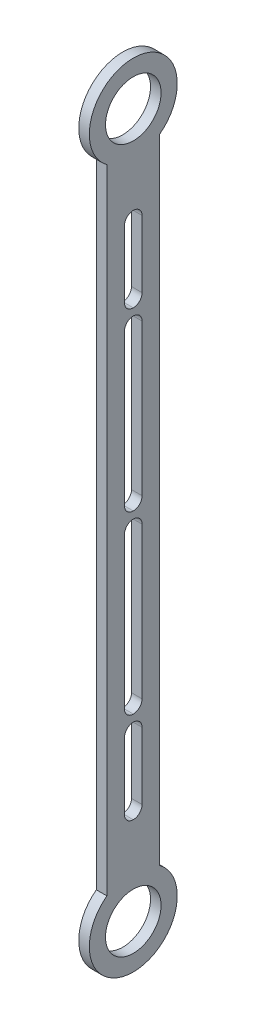
ISO-10303-21;
HEADER;
FILE_DESCRIPTION(('STEP AP214'),'2;1');
FILE_NAME('part.step','',(''),(''),'','','');
FILE_SCHEMA(('AUTOMOTIVE_DESIGN { 1 0 10303 214 1 1 1 1 }'));
ENDSEC;
DATA;
#1=APPLICATION_CONTEXT('core data for automotive mechanical design processes');
#2=APPLICATION_PROTOCOL_DEFINITION('international standard','automotive_design',2000,#1);
#3=PRODUCT_CONTEXT('',#1,'mechanical');
#4=PRODUCT('Part','Part','',(#3));
#5=PRODUCT_RELATED_PRODUCT_CATEGORY('part','',(#4));
#6=PRODUCT_DEFINITION_FORMATION('','',#4);
#7=PRODUCT_DEFINITION_CONTEXT('part definition',#1,'design');
#8=PRODUCT_DEFINITION('design','',#6,#7);
#9=PRODUCT_DEFINITION_SHAPE('','',#8);
#10=(LENGTH_UNIT() NAMED_UNIT(*) SI_UNIT(.MILLI.,.METRE.));
#11=(NAMED_UNIT(*) PLANE_ANGLE_UNIT() SI_UNIT($,.RADIAN.));
#12=(NAMED_UNIT(*) SI_UNIT($,.STERADIAN.) SOLID_ANGLE_UNIT());
#13=UNCERTAINTY_MEASURE_WITH_UNIT(LENGTH_MEASURE(1.E-05),#10,'distance_accuracy_value','');
#14=(GEOMETRIC_REPRESENTATION_CONTEXT(3) GLOBAL_UNCERTAINTY_ASSIGNED_CONTEXT((#13)) GLOBAL_UNIT_ASSIGNED_CONTEXT((#10,
#11,#12)) REPRESENTATION_CONTEXT('',''));
#15=CARTESIAN_POINT('',(0.,0.,0.));
#16=DIRECTION('',(0.,0.,1.));
#17=DIRECTION('',(1.,0.,0.));
#18=AXIS2_PLACEMENT_3D('',#15,#16,#17);
#19=CARTESIAN_POINT('',(0.,175.,2.50000000000002));
#20=DIRECTION('',(0.,0.,1.));
#21=DIRECTION('',(0.,-1.,0.));
#22=AXIS2_PLACEMENT_3D('',#19,#20,#21);
#23=PLANE('',#22);
#24=DIRECTION('',(0.,-1.,0.));
#25=VECTOR('',#24,1.);
#26=CARTESIAN_POINT('',(3.,175.,2.50000000000002));
#27=LINE('',#26,#25);
#28=CARTESIAN_POINT('',(3.,96.5070441090992,2.50000000000001));
#29=VERTEX_POINT('',#28);
#30=CARTESIAN_POINT('',(3.,53.5070441090992,2.5));
#31=VERTEX_POINT('',#30);
#32=EDGE_CURVE('E496',#29,#31,#27,.T.);
#33=ORIENTED_EDGE('',*,*,#32,.T.);
#34=DIRECTION('',(1.,0.,0.));
#35=VECTOR('',#34,1.);
#36=CARTESIAN_POINT('',(0.,53.5070441090992,2.5));
#37=LINE('',#36,#35);
#38=CARTESIAN_POINT('',(0.,53.5070441090992,2.5));
#39=VERTEX_POINT('',#38);
#40=EDGE_CURVE('E332',#31,#39,#37,.F.);
#41=ORIENTED_EDGE('',*,*,#40,.T.);
#42=DIRECTION('',(0.,-1.,0.));
#43=VECTOR('',#42,1.);
#44=CARTESIAN_POINT('',(0.,175.,2.50000000000002));
#45=LINE('',#44,#43);
#46=CARTESIAN_POINT('',(0.,96.5070441090992,2.50000000000001));
#47=VERTEX_POINT('',#46);
#48=EDGE_CURVE('E456',#47,#39,#45,.T.);
#49=ORIENTED_EDGE('',*,*,#48,.F.);
#50=DIRECTION('',(1.,0.,0.));
#51=VECTOR('',#50,1.);
#52=CARTESIAN_POINT('',(0.,96.5070441090992,2.50000000000001));
#53=LINE('',#52,#51);
#54=EDGE_CURVE('E330',#47,#29,#53,.T.);
#55=ORIENTED_EDGE('',*,*,#54,.T.);
#56=EDGE_LOOP('',(#33,#41,#49,#55));
#57=FACE_BOUND('',#56,.T.);
#58=ADVANCED_FACE('F38',(#57),#23,.F.);
#59=CARTESIAN_POINT('',(0.,175.,-2.50000000000002));
#60=DIRECTION('',(0.,0.,-1.));
#61=DIRECTION('',(0.,1.,0.));
#62=AXIS2_PLACEMENT_3D('',#59,#60,#61);
#63=PLANE('',#62);
#64=DIRECTION('',(0.,1.,0.));
#65=VECTOR('',#64,1.);
#66=CARTESIAN_POINT('',(0.,175.,-2.50000000000002));
#67=LINE('',#66,#65);
#68=CARTESIAN_POINT('',(0.,53.5070441090992,-2.5));
#69=VERTEX_POINT('',#68);
#70=CARTESIAN_POINT('',(0.,96.5070441090992,-2.50000000000001));
#71=VERTEX_POINT('',#70);
#72=EDGE_CURVE('E427',#69,#71,#67,.T.);
#73=ORIENTED_EDGE('',*,*,#72,.F.);
#74=DIRECTION('',(1.,0.,0.));
#75=VECTOR('',#74,1.);
#76=CARTESIAN_POINT('',(0.,53.5070441090992,-2.5));
#77=LINE('',#76,#75);
#78=CARTESIAN_POINT('',(3.,53.5070441090992,-2.5));
#79=VERTEX_POINT('',#78);
#80=EDGE_CURVE('E338',#69,#79,#77,.T.);
#81=ORIENTED_EDGE('',*,*,#80,.T.);
#82=DIRECTION('',(0.,1.,0.));
#83=VECTOR('',#82,1.);
#84=CARTESIAN_POINT('',(3.,175.,-2.50000000000002));
#85=LINE('',#84,#83);
#86=CARTESIAN_POINT('',(3.,96.5070441090992,-2.50000000000001));
#87=VERTEX_POINT('',#86);
#88=EDGE_CURVE('E459',#79,#87,#85,.T.);
#89=ORIENTED_EDGE('',*,*,#88,.T.);
#90=DIRECTION('',(1.,0.,0.));
#91=VECTOR('',#90,1.);
#92=CARTESIAN_POINT('',(0.,96.5070441090992,-2.50000000000001));
#93=LINE('',#92,#91);
#94=EDGE_CURVE('E335',#87,#71,#93,.F.);
#95=ORIENTED_EDGE('',*,*,#94,.T.);
#96=EDGE_LOOP('',(#73,#81,#89,#95));
#97=FACE_BOUND('',#96,.T.);
#98=ADVANCED_FACE('F514',(#97),#63,.F.);
#99=CARTESIAN_POINT('',(3.,172.5,2.50000000000002));
#100=VERTEX_POINT('',#99);
#101=CARTESIAN_POINT('',(3.,153.507044109099,2.50000000000002));
#102=VERTEX_POINT('',#101);
#103=EDGE_CURVE('E464',#100,#102,#27,.T.);
#104=ORIENTED_EDGE('',*,*,#103,.T.);
#105=DIRECTION('',(1.,0.,0.));
#106=VECTOR('',#105,1.);
#107=CARTESIAN_POINT('',(0.,153.507044109099,2.50000000000002));
#108=LINE('',#107,#106);
#109=CARTESIAN_POINT('',(0.,153.507044109099,2.50000000000002));
#110=VERTEX_POINT('',#109);
#111=EDGE_CURVE('E345',#102,#110,#108,.F.);
#112=ORIENTED_EDGE('',*,*,#111,.T.);
#113=CARTESIAN_POINT('',(0.,172.5,2.50000000000002));
#114=VERTEX_POINT('',#113);
#115=EDGE_CURVE('E425',#114,#110,#45,.T.);
#116=ORIENTED_EDGE('',*,*,#115,.F.);
#117=DIRECTION('',(1.,0.,0.));
#118=VECTOR('',#117,1.);
#119=CARTESIAN_POINT('',(3.,172.5,2.50000000000002));
#120=LINE('',#119,#118);
#121=EDGE_CURVE('E286',#114,#100,#120,.T.);
#122=ORIENTED_EDGE('',*,*,#121,.T.);
#123=EDGE_LOOP('',(#104,#112,#116,#122));
#124=FACE_BOUND('',#123,.T.);
#125=ADVANCED_FACE('F524',(#124),#23,.F.);
#126=CARTESIAN_POINT('',(0.,153.507044109099,-2.50000000000002));
#127=VERTEX_POINT('',#126);
#128=CARTESIAN_POINT('',(0.,172.5,-2.50000000000002));
#129=VERTEX_POINT('',#128);
#130=EDGE_CURVE('E419',#127,#129,#67,.T.);
#131=ORIENTED_EDGE('',*,*,#130,.F.);
#132=DIRECTION('',(1.,0.,0.));
#133=VECTOR('',#132,1.);
#134=CARTESIAN_POINT('',(0.,153.507044109099,-2.50000000000002));
#135=LINE('',#134,#133);
#136=CARTESIAN_POINT('',(3.,153.507044109099,-2.50000000000002));
#137=VERTEX_POINT('',#136);
#138=EDGE_CURVE('E348',#127,#137,#135,.T.);
#139=ORIENTED_EDGE('',*,*,#138,.T.);
#140=CARTESIAN_POINT('',(3.,172.5,-2.50000000000002));
#141=VERTEX_POINT('',#140);
#142=EDGE_CURVE('E460',#137,#141,#85,.T.);
#143=ORIENTED_EDGE('',*,*,#142,.T.);
#144=DIRECTION('',(1.,0.,0.));
#145=VECTOR('',#144,1.);
#146=CARTESIAN_POINT('',(0.,172.5,-2.50000000000002));
#147=LINE('',#146,#145);
#148=EDGE_CURVE('E291',#141,#129,#147,.F.);
#149=ORIENTED_EDGE('',*,*,#148,.T.);
#150=EDGE_LOOP('',(#131,#139,#143,#149));
#151=FACE_BOUND('',#150,.T.);
#152=ADVANCED_FACE('F421',(#151),#63,.F.);
#153=CARTESIAN_POINT('',(3.,146.507044109099,2.50000000000001));
#154=VERTEX_POINT('',#153);
#155=CARTESIAN_POINT('',(3.,103.507044109099,2.50000000000001));
#156=VERTEX_POINT('',#155);
#157=EDGE_CURVE('E495',#154,#156,#27,.T.);
#158=ORIENTED_EDGE('',*,*,#157,.T.);
#159=DIRECTION('',(1.,0.,0.));
#160=VECTOR('',#159,1.);
#161=CARTESIAN_POINT('',(0.,103.507044109099,2.50000000000001));
#162=LINE('',#161,#160);
#163=CARTESIAN_POINT('',(0.,103.507044109099,2.50000000000001));
#164=VERTEX_POINT('',#163);
#165=EDGE_CURVE('E328',#156,#164,#162,.F.);
#166=ORIENTED_EDGE('',*,*,#165,.T.);
#167=CARTESIAN_POINT('',(0.,146.507044109099,2.50000000000001));
#168=VERTEX_POINT('',#167);
#169=EDGE_CURVE('E429',#168,#164,#45,.T.);
#170=ORIENTED_EDGE('',*,*,#169,.F.);
#171=DIRECTION('',(1.,0.,0.));
#172=VECTOR('',#171,1.);
#173=CARTESIAN_POINT('',(0.,146.507044109099,2.50000000000001));
#174=LINE('',#173,#172);
#175=EDGE_CURVE('E325',#168,#154,#174,.T.);
#176=ORIENTED_EDGE('',*,*,#175,.T.);
#177=EDGE_LOOP('',(#158,#166,#170,#176));
#178=FACE_BOUND('',#177,.T.);
#179=ADVANCED_FACE('F493',(#178),#23,.F.);
#180=CARTESIAN_POINT('',(0.,103.507044109099,-2.50000000000001));
#181=VERTEX_POINT('',#180);
#182=CARTESIAN_POINT('',(0.,146.507044109099,-2.50000000000001));
#183=VERTEX_POINT('',#182);
#184=EDGE_CURVE('E424',#181,#183,#67,.T.);
#185=ORIENTED_EDGE('',*,*,#184,.F.);
#186=DIRECTION('',(1.,0.,0.));
#187=VECTOR('',#186,1.);
#188=CARTESIAN_POINT('',(0.,103.507044109099,-2.50000000000001));
#189=LINE('',#188,#187);
#190=CARTESIAN_POINT('',(3.,103.507044109099,-2.50000000000001));
#191=VERTEX_POINT('',#190);
#192=EDGE_CURVE('E322',#181,#191,#189,.T.);
#193=ORIENTED_EDGE('',*,*,#192,.T.);
#194=CARTESIAN_POINT('',(3.,146.507044109099,-2.50000000000001));
#195=VERTEX_POINT('',#194);
#196=EDGE_CURVE('E461',#191,#195,#85,.T.);
#197=ORIENTED_EDGE('',*,*,#196,.T.);
#198=DIRECTION('',(1.,0.,0.));
#199=VECTOR('',#198,1.);
#200=CARTESIAN_POINT('',(0.,146.507044109099,-2.50000000000001));
#201=LINE('',#200,#199);
#202=EDGE_CURVE('E312',#195,#183,#201,.F.);
#203=ORIENTED_EDGE('',*,*,#202,.T.);
#204=EDGE_LOOP('',(#185,#193,#197,#203));
#205=FACE_BOUND('',#204,.T.);
#206=ADVANCED_FACE('F470',(#205),#63,.F.);
#207=CARTESIAN_POINT('',(3.,0.,7.50000000000003));
#208=DIRECTION('',(0.,0.,1.));
#209=DIRECTION('',(1.,0.,0.));
#210=AXIS2_PLACEMENT_3D('',#207,#208,#209);
#211=PLANE('',#210);
#212=DIRECTION('',(0.,1.,0.));
#213=VECTOR('',#212,1.);
#214=CARTESIAN_POINT('',(0.,0.,7.50000000000003));
#215=LINE('',#214,#213);
#216=CARTESIAN_POINT('',(0.,9.99999999999998,7.50000000000003));
#217=VERTEX_POINT('',#216);
#218=CARTESIAN_POINT('',(0.,190.,7.50000000000002));
#219=VERTEX_POINT('',#218);
#220=EDGE_CURVE('E230',#217,#219,#215,.T.);
#221=ORIENTED_EDGE('',*,*,#220,.F.);
#222=DIRECTION('',(-1.,0.,0.));
#223=VECTOR('',#222,1.);
#224=CARTESIAN_POINT('',(3.,9.99999999999998,7.50000000000003));
#225=LINE('',#224,#223);
#226=CARTESIAN_POINT('',(3.,9.99999999999998,7.50000000000003));
#227=VERTEX_POINT('',#226);
#228=EDGE_CURVE('E224',#227,#217,#225,.T.);
#229=ORIENTED_EDGE('',*,*,#228,.F.);
#230=DIRECTION('',(0.,1.,0.));
#231=VECTOR('',#230,1.);
#232=CARTESIAN_POINT('',(3.,0.,7.50000000000003));
#233=LINE('',#232,#231);
#234=CARTESIAN_POINT('',(3.,190.,7.50000000000002));
#235=VERTEX_POINT('',#234);
#236=EDGE_CURVE('E228',#227,#235,#233,.T.);
#237=ORIENTED_EDGE('',*,*,#236,.T.);
#238=DIRECTION('',(-1.,0.,0.));
#239=VECTOR('',#238,1.);
#240=CARTESIAN_POINT('',(3.,190.,7.50000000000002));
#241=LINE('',#240,#239);
#242=EDGE_CURVE('E267',#235,#219,#241,.T.);
#243=ORIENTED_EDGE('',*,*,#242,.T.);
#244=EDGE_LOOP('',(#221,#229,#237,#243));
#245=FACE_BOUND('',#244,.T.);
#246=ADVANCED_FACE('F226',(#245),#211,.T.);
#247=CARTESIAN_POINT('',(3.,0.,0.));
#248=DIRECTION('',(-1.,0.,0.));
#249=DIRECTION('',(0.,0.,1.));
#250=AXIS2_PLACEMENT_3D('',#247,#248,#249);
#251=CYLINDRICAL_SURFACE('',#250,12.5);
#252=CARTESIAN_POINT('',(0.,0.,0.));
#253=DIRECTION('',(1.,0.,0.));
#254=DIRECTION('',(0.,0.,-1.));
#255=AXIS2_PLACEMENT_3D('',#252,#253,#254);
#256=CIRCLE('',#255,12.5);
#257=CARTESIAN_POINT('',(0.,10.,-7.49999999999998));
#258=VERTEX_POINT('',#257);
#259=EDGE_CURVE('E269',#217,#258,#256,.T.);
#260=ORIENTED_EDGE('',*,*,#259,.T.);
#261=DIRECTION('',(-1.,0.,0.));
#262=VECTOR('',#261,1.);
#263=CARTESIAN_POINT('',(3.,10.,-7.49999999999998));
#264=LINE('',#263,#262);
#265=CARTESIAN_POINT('',(3.,10.,-7.49999999999998));
#266=VERTEX_POINT('',#265);
#267=EDGE_CURVE('E235',#266,#258,#264,.T.);
#268=ORIENTED_EDGE('',*,*,#267,.F.);
#269=CARTESIAN_POINT('',(3.,0.,0.));
#270=DIRECTION('',(1.,0.,0.));
#271=DIRECTION('',(0.,0.,-1.));
#272=AXIS2_PLACEMENT_3D('',#269,#270,#271);
#273=CIRCLE('',#272,12.5);
#274=EDGE_CURVE('E238',#227,#266,#273,.T.);
#275=ORIENTED_EDGE('',*,*,#274,.F.);
#276=ORIENTED_EDGE('',*,*,#228,.T.);
#277=EDGE_LOOP('',(#260,#268,#275,#276));
#278=FACE_BOUND('',#277,.T.);
#279=ADVANCED_FACE('F239',(#278),#251,.T.);
#280=CARTESIAN_POINT('',(3.,0.,-7.49999999999998));
#281=DIRECTION('',(0.,0.,-1.));
#282=DIRECTION('',(0.,1.,0.));
#283=AXIS2_PLACEMENT_3D('',#280,#281,#282);
#284=PLANE('',#283);
#285=DIRECTION('',(0.,-1.,0.));
#286=VECTOR('',#285,1.);
#287=CARTESIAN_POINT('',(0.,0.,-7.49999999999998));
#288=LINE('',#287,#286);
#289=CARTESIAN_POINT('',(0.,190.,-7.49999999999996));
#290=VERTEX_POINT('',#289);
#291=EDGE_CURVE('E272',#290,#258,#288,.T.);
#292=ORIENTED_EDGE('',*,*,#291,.F.);
#293=DIRECTION('',(-1.,0.,0.));
#294=VECTOR('',#293,1.);
#295=CARTESIAN_POINT('',(3.,190.,-7.49999999999996));
#296=LINE('',#295,#294);
#297=CARTESIAN_POINT('',(3.,190.,-7.49999999999996));
#298=VERTEX_POINT('',#297);
#299=EDGE_CURVE('E281',#298,#290,#296,.T.);
#300=ORIENTED_EDGE('',*,*,#299,.F.);
#301=DIRECTION('',(0.,-1.,0.));
#302=VECTOR('',#301,1.);
#303=CARTESIAN_POINT('',(3.,0.,-7.49999999999998));
#304=LINE('',#303,#302);
#305=EDGE_CURVE('E243',#298,#266,#304,.T.);
#306=ORIENTED_EDGE('',*,*,#305,.T.);
#307=ORIENTED_EDGE('',*,*,#267,.T.);
#308=EDGE_LOOP('',(#292,#300,#306,#307));
#309=FACE_BOUND('',#308,.T.);
#310=ADVANCED_FACE('F558',(#309),#284,.T.);
#311=CARTESIAN_POINT('',(3.,200.,0.));
#312=DIRECTION('',(-1.,0.,0.));
#313=DIRECTION('',(0.,0.,1.));
#314=AXIS2_PLACEMENT_3D('',#311,#312,#313);
#315=CYLINDRICAL_SURFACE('',#314,7.9);
#316=CARTESIAN_POINT('',(3.,200.,0.));
#317=DIRECTION('',(1.,0.,0.));
#318=DIRECTION('',(0.,0.,-1.));
#319=AXIS2_PLACEMENT_3D('',#316,#317,#318);
#320=CIRCLE('',#319,7.9);
#321=CARTESIAN_POINT('',(3.,200.,-7.9));
#322=VERTEX_POINT('',#321);
#323=EDGE_CURVE('E261',#322,#322,#320,.T.);
#324=ORIENTED_EDGE('',*,*,#323,.T.);
#325=EDGE_LOOP('',(#324));
#326=FACE_BOUND('',#325,.T.);
#327=CARTESIAN_POINT('',(0.,200.,0.));
#328=DIRECTION('',(1.,0.,0.));
#329=DIRECTION('',(0.,0.,-1.));
#330=AXIS2_PLACEMENT_3D('',#327,#328,#329);
#331=CIRCLE('',#330,7.9);
#332=CARTESIAN_POINT('',(0.,200.,-7.9));
#333=VERTEX_POINT('',#332);
#334=EDGE_CURVE('E253',#333,#333,#331,.T.);
#335=ORIENTED_EDGE('',*,*,#334,.F.);
#336=EDGE_LOOP('',(#335));
#337=FACE_BOUND('',#336,.T.);
#338=ADVANCED_FACE('F565',(#326,#337),#315,.F.);
#339=CARTESIAN_POINT('',(3.,200.,0.));
#340=DIRECTION('',(-1.,0.,0.));
#341=DIRECTION('',(0.,0.,1.));
#342=AXIS2_PLACEMENT_3D('',#339,#340,#341);
#343=CYLINDRICAL_SURFACE('',#342,12.5);
#344=CARTESIAN_POINT('',(0.,200.,0.));
#345=DIRECTION('',(1.,0.,0.));
#346=DIRECTION('',(0.,0.,-1.));
#347=AXIS2_PLACEMENT_3D('',#344,#345,#346);
#348=CIRCLE('',#347,12.5);
#349=EDGE_CURVE('E275',#290,#219,#348,.T.);
#350=ORIENTED_EDGE('',*,*,#349,.T.);
#351=ORIENTED_EDGE('',*,*,#242,.F.);
#352=CARTESIAN_POINT('',(3.,200.,0.));
#353=DIRECTION('',(1.,0.,0.));
#354=DIRECTION('',(0.,0.,-1.));
#355=AXIS2_PLACEMENT_3D('',#352,#353,#354);
#356=CIRCLE('',#355,12.5);
#357=EDGE_CURVE('E248',#298,#235,#356,.T.);
#358=ORIENTED_EDGE('',*,*,#357,.F.);
#359=ORIENTED_EDGE('',*,*,#299,.T.);
#360=EDGE_LOOP('',(#350,#351,#358,#359));
#361=FACE_BOUND('',#360,.T.);
#362=ADVANCED_FACE('F573',(#361),#343,.T.);
#363=CARTESIAN_POINT('',(3.,0.,0.));
#364=DIRECTION('',(-1.,0.,0.));
#365=DIRECTION('',(0.,0.,1.));
#366=AXIS2_PLACEMENT_3D('',#363,#364,#365);
#367=CYLINDRICAL_SURFACE('',#366,7.9);
#368=CARTESIAN_POINT('',(3.,0.,0.));
#369=DIRECTION('',(1.,0.,0.));
#370=DIRECTION('',(0.,0.,-1.));
#371=AXIS2_PLACEMENT_3D('',#368,#369,#370);
#372=CIRCLE('',#371,7.9);
#373=CARTESIAN_POINT('',(3.,0.,-7.9));
#374=VERTEX_POINT('',#373);
#375=EDGE_CURVE('E264',#374,#374,#372,.T.);
#376=ORIENTED_EDGE('',*,*,#375,.T.);
#377=EDGE_LOOP('',(#376));
#378=FACE_BOUND('',#377,.T.);
#379=CARTESIAN_POINT('',(0.,0.,0.));
#380=DIRECTION('',(1.,0.,0.));
#381=DIRECTION('',(0.,0.,-1.));
#382=AXIS2_PLACEMENT_3D('',#379,#380,#381);
#383=CIRCLE('',#382,7.9);
#384=CARTESIAN_POINT('',(0.,0.,-7.9));
#385=VERTEX_POINT('',#384);
#386=EDGE_CURVE('E250',#385,#385,#383,.T.);
#387=ORIENTED_EDGE('',*,*,#386,.F.);
#388=EDGE_LOOP('',(#387));
#389=FACE_BOUND('',#388,.T.);
#390=ADVANCED_FACE('F581',(#378,#389),#367,.F.);
#391=CARTESIAN_POINT('',(3.,0.,0.));
#392=DIRECTION('',(1.,0.,0.));
#393=DIRECTION('',(0.,0.,-1.));
#394=AXIS2_PLACEMENT_3D('',#391,#392,#393);
#395=PLANE('',#394);
#396=CARTESIAN_POINT('',(3.,46.5070441090992,0.));
#397=DIRECTION('',(1.,0.,0.));
#398=DIRECTION('',(0.,0.,-1.));
#399=AXIS2_PLACEMENT_3D('',#396,#397,#398);
#400=CIRCLE('',#399,2.5);
#401=CARTESIAN_POINT('',(3.,46.5070441090992,2.5));
#402=VERTEX_POINT('',#401);
#403=CARTESIAN_POINT('',(3.,49.0070441090992,0.));
#404=VERTEX_POINT('',#403);
#405=EDGE_CURVE('E366',#402,#404,#400,.F.);
#406=ORIENTED_EDGE('',*,*,#405,.T.);
#407=CARTESIAN_POINT('',(3.,46.5070441090992,0.));
#408=DIRECTION('',(1.,0.,0.));
#409=DIRECTION('',(0.,0.,-1.));
#410=AXIS2_PLACEMENT_3D('',#407,#408,#409);
#411=CIRCLE('',#410,2.5);
#412=CARTESIAN_POINT('',(3.,46.5070441090992,-2.5));
#413=VERTEX_POINT('',#412);
#414=EDGE_CURVE('E370',#404,#413,#411,.F.);
#415=ORIENTED_EDGE('',*,*,#414,.T.);
#416=CARTESIAN_POINT('',(3.,27.5,-2.5));
#417=VERTEX_POINT('',#416);
#418=EDGE_CURVE('E256',#417,#413,#85,.T.);
#419=ORIENTED_EDGE('',*,*,#418,.F.);
#420=CARTESIAN_POINT('',(3.,27.5,0.));
#421=DIRECTION('',(1.,0.,0.));
#422=DIRECTION('',(0.,0.,-1.));
#423=AXIS2_PLACEMENT_3D('',#420,#421,#422);
#424=CIRCLE('',#423,2.5);
#425=CARTESIAN_POINT('',(3.,25.,0.));
#426=VERTEX_POINT('',#425);
#427=EDGE_CURVE('E308',#417,#426,#424,.F.);
#428=ORIENTED_EDGE('',*,*,#427,.T.);
#429=CARTESIAN_POINT('',(3.,27.5,0.));
#430=DIRECTION('',(1.,0.,0.));
#431=DIRECTION('',(0.,0.,-1.));
#432=AXIS2_PLACEMENT_3D('',#429,#430,#431);
#433=CIRCLE('',#432,2.5);
#434=CARTESIAN_POINT('',(3.,27.5,2.5));
#435=VERTEX_POINT('',#434);
#436=EDGE_CURVE('E303',#426,#435,#433,.F.);
#437=ORIENTED_EDGE('',*,*,#436,.T.);
#438=EDGE_CURVE('E316',#402,#435,#27,.T.);
#439=ORIENTED_EDGE('',*,*,#438,.F.);
#440=EDGE_LOOP('',(#406,#415,#419,#428,#437,#439));
#441=FACE_BOUND('',#440,.T.);
#442=CARTESIAN_POINT('',(3.,146.507044109099,0.));
#443=DIRECTION('',(1.,0.,0.));
#444=DIRECTION('',(0.,0.,-1.));
#445=AXIS2_PLACEMENT_3D('',#442,#443,#444);
#446=CIRCLE('',#445,2.5);
#447=CARTESIAN_POINT('',(3.,149.007044109099,0.));
#448=VERTEX_POINT('',#447);
#449=EDGE_CURVE('E382',#154,#448,#446,.F.);
#450=ORIENTED_EDGE('',*,*,#449,.T.);
#451=CARTESIAN_POINT('',(3.,146.507044109099,0.));
#452=DIRECTION('',(1.,0.,0.));
#453=DIRECTION('',(0.,0.,-1.));
#454=AXIS2_PLACEMENT_3D('',#451,#452,#453);
#455=CIRCLE('',#454,2.5);
#456=EDGE_CURVE('E386',#448,#195,#455,.F.);
#457=ORIENTED_EDGE('',*,*,#456,.T.);
#458=ORIENTED_EDGE('',*,*,#196,.F.);
#459=CARTESIAN_POINT('',(3.,103.507044109099,0.));
#460=DIRECTION('',(1.,0.,0.));
#461=DIRECTION('',(0.,0.,-1.));
#462=AXIS2_PLACEMENT_3D('',#459,#460,#461);
#463=CIRCLE('',#462,2.5);
#464=CARTESIAN_POINT('',(3.,101.007044109099,0.));
#465=VERTEX_POINT('',#464);
#466=EDGE_CURVE('E350',#191,#465,#463,.F.);
#467=ORIENTED_EDGE('',*,*,#466,.T.);
#468=CARTESIAN_POINT('',(3.,103.507044109099,0.));
#469=DIRECTION('',(1.,0.,0.));
#470=DIRECTION('',(0.,0.,-1.));
#471=AXIS2_PLACEMENT_3D('',#468,#469,#470);
#472=CIRCLE('',#471,2.5);
#473=EDGE_CURVE('E354',#465,#156,#472,.F.);
#474=ORIENTED_EDGE('',*,*,#473,.T.);
#475=ORIENTED_EDGE('',*,*,#157,.F.);
#476=EDGE_LOOP('',(#450,#457,#458,#467,#474,#475));
#477=FACE_BOUND('',#476,.T.);
#478=ORIENTED_EDGE('',*,*,#32,.F.);
#479=CARTESIAN_POINT('',(3.,96.5070441090992,0.));
#480=DIRECTION('',(1.,0.,0.));
#481=DIRECTION('',(0.,0.,-1.));
#482=AXIS2_PLACEMENT_3D('',#479,#480,#481);
#483=CIRCLE('',#482,2.5);
#484=CARTESIAN_POINT('',(3.,99.0070441090992,0.));
#485=VERTEX_POINT('',#484);
#486=EDGE_CURVE('E378',#29,#485,#483,.F.);
#487=ORIENTED_EDGE('',*,*,#486,.T.);
#488=CARTESIAN_POINT('',(3.,96.5070441090992,0.));
#489=DIRECTION('',(1.,0.,0.));
#490=DIRECTION('',(0.,0.,-1.));
#491=AXIS2_PLACEMENT_3D('',#488,#489,#490);
#492=CIRCLE('',#491,2.5);
#493=EDGE_CURVE('E374',#485,#87,#492,.F.);
#494=ORIENTED_EDGE('',*,*,#493,.T.);
#495=ORIENTED_EDGE('',*,*,#88,.F.);
#496=CARTESIAN_POINT('',(3.,53.5070441090992,0.));
#497=DIRECTION('',(1.,0.,0.));
#498=DIRECTION('',(0.,0.,-1.));
#499=AXIS2_PLACEMENT_3D('',#496,#497,#498);
#500=CIRCLE('',#499,2.5);
#501=CARTESIAN_POINT('',(3.,51.0070441090992,0.));
#502=VERTEX_POINT('',#501);
#503=EDGE_CURVE('E362',#79,#502,#500,.F.);
#504=ORIENTED_EDGE('',*,*,#503,.T.);
#505=CARTESIAN_POINT('',(3.,53.5070441090992,0.));
#506=DIRECTION('',(1.,0.,0.));
#507=DIRECTION('',(0.,0.,-1.));
#508=AXIS2_PLACEMENT_3D('',#505,#506,#507);
#509=CIRCLE('',#508,2.5);
#510=EDGE_CURVE('E358',#502,#31,#509,.F.);
#511=ORIENTED_EDGE('',*,*,#510,.T.);
#512=EDGE_LOOP('',(#478,#487,#494,#495,#504,#511));
#513=FACE_BOUND('',#512,.T.);
#514=CARTESIAN_POINT('',(3.,172.5,0.));
#515=DIRECTION('',(1.,0.,0.));
#516=DIRECTION('',(0.,0.,-1.));
#517=AXIS2_PLACEMENT_3D('',#514,#515,#516);
#518=CIRCLE('',#517,2.5);
#519=CARTESIAN_POINT('',(3.,175.,0.));
#520=VERTEX_POINT('',#519);
#521=EDGE_CURVE('E294',#100,#520,#518,.F.);
#522=ORIENTED_EDGE('',*,*,#521,.T.);
#523=CARTESIAN_POINT('',(3.,172.5,0.));
#524=DIRECTION('',(1.,0.,0.));
#525=DIRECTION('',(0.,0.,-1.));
#526=AXIS2_PLACEMENT_3D('',#523,#524,#525);
#527=CIRCLE('',#526,2.5);
#528=EDGE_CURVE('E298',#520,#141,#527,.F.);
#529=ORIENTED_EDGE('',*,*,#528,.T.);
#530=ORIENTED_EDGE('',*,*,#142,.F.);
#531=CARTESIAN_POINT('',(3.,153.507044109099,0.));
#532=DIRECTION('',(1.,0.,0.));
#533=DIRECTION('',(0.,0.,-1.));
#534=AXIS2_PLACEMENT_3D('',#531,#532,#533);
#535=CIRCLE('',#534,2.5);
#536=CARTESIAN_POINT('',(3.,151.007044109099,0.));
#537=VERTEX_POINT('',#536);
#538=EDGE_CURVE('E47',#137,#537,#535,.F.);
#539=ORIENTED_EDGE('',*,*,#538,.T.);
#540=CARTESIAN_POINT('',(3.,153.507044109099,0.));
#541=DIRECTION('',(1.,0.,0.));
#542=DIRECTION('',(0.,0.,-1.));
#543=AXIS2_PLACEMENT_3D('',#540,#541,#542);
#544=CIRCLE('',#543,2.5);
#545=EDGE_CURVE('E390',#537,#102,#544,.F.);
#546=ORIENTED_EDGE('',*,*,#545,.T.);
#547=ORIENTED_EDGE('',*,*,#103,.F.);
#548=EDGE_LOOP('',(#522,#529,#530,#539,#546,#547));
#549=FACE_BOUND('',#548,.T.);
#550=ORIENTED_EDGE('',*,*,#236,.F.);
#551=ORIENTED_EDGE('',*,*,#274,.T.);
#552=ORIENTED_EDGE('',*,*,#305,.F.);
#553=ORIENTED_EDGE('',*,*,#357,.T.);
#554=EDGE_LOOP('',(#550,#551,#552,#553));
#555=FACE_BOUND('',#554,.T.);
#556=ORIENTED_EDGE('',*,*,#323,.F.);
#557=EDGE_LOOP('',(#556));
#558=FACE_BOUND('',#557,.T.);
#559=ORIENTED_EDGE('',*,*,#375,.F.);
#560=EDGE_LOOP('',(#559));
#561=FACE_BOUND('',#560,.T.);
#562=ADVANCED_FACE('F245',(#441,#477,#513,#549,#555,#558,#561),#395,.T.);
#563=CARTESIAN_POINT('',(0.,0.,0.));
#564=DIRECTION('',(1.,0.,0.));
#565=DIRECTION('',(0.,0.,-1.));
#566=AXIS2_PLACEMENT_3D('',#563,#564,#565);
#567=PLANE('',#566);
#568=CARTESIAN_POINT('',(0.,27.5,-2.5));
#569=VERTEX_POINT('',#568);
#570=CARTESIAN_POINT('',(0.,46.5070441090992,-2.5));
#571=VERTEX_POINT('',#570);
#572=EDGE_CURVE('E270',#569,#571,#67,.T.);
#573=ORIENTED_EDGE('',*,*,#572,.T.);
#574=CARTESIAN_POINT('',(0.,46.5070441090992,0.));
#575=DIRECTION('',(1.,0.,0.));
#576=DIRECTION('',(0.,0.,-1.));
#577=AXIS2_PLACEMENT_3D('',#574,#575,#576);
#578=CIRCLE('',#577,2.5);
#579=CARTESIAN_POINT('',(0.,49.0070441090992,0.));
#580=VERTEX_POINT('',#579);
#581=EDGE_CURVE('E372',#571,#580,#578,.T.);
#582=ORIENTED_EDGE('',*,*,#581,.T.);
#583=CARTESIAN_POINT('',(0.,46.5070441090992,0.));
#584=DIRECTION('',(1.,0.,0.));
#585=DIRECTION('',(0.,0.,-1.));
#586=AXIS2_PLACEMENT_3D('',#583,#584,#585);
#587=CIRCLE('',#586,2.5);
#588=CARTESIAN_POINT('',(0.,46.5070441090992,2.5));
#589=VERTEX_POINT('',#588);
#590=EDGE_CURVE('E368',#580,#589,#587,.T.);
#591=ORIENTED_EDGE('',*,*,#590,.T.);
#592=CARTESIAN_POINT('',(0.,27.5,2.5));
#593=VERTEX_POINT('',#592);
#594=EDGE_CURVE('E431',#589,#593,#45,.T.);
#595=ORIENTED_EDGE('',*,*,#594,.T.);
#596=CARTESIAN_POINT('',(0.,27.5,0.));
#597=DIRECTION('',(1.,0.,0.));
#598=DIRECTION('',(0.,0.,-1.));
#599=AXIS2_PLACEMENT_3D('',#596,#597,#598);
#600=CIRCLE('',#599,2.5);
#601=CARTESIAN_POINT('',(0.,25.,0.));
#602=VERTEX_POINT('',#601);
#603=EDGE_CURVE('E306',#593,#602,#600,.T.);
#604=ORIENTED_EDGE('',*,*,#603,.T.);
#605=CARTESIAN_POINT('',(0.,27.5,0.));
#606=DIRECTION('',(1.,0.,0.));
#607=DIRECTION('',(0.,0.,-1.));
#608=AXIS2_PLACEMENT_3D('',#605,#606,#607);
#609=CIRCLE('',#608,2.5);
#610=EDGE_CURVE('E310',#602,#569,#609,.T.);
#611=ORIENTED_EDGE('',*,*,#610,.T.);
#612=EDGE_LOOP('',(#573,#582,#591,#595,#604,#611));
#613=FACE_BOUND('',#612,.T.);
#614=ORIENTED_EDGE('',*,*,#184,.T.);
#615=CARTESIAN_POINT('',(0.,146.507044109099,0.));
#616=DIRECTION('',(1.,0.,0.));
#617=DIRECTION('',(0.,0.,-1.));
#618=AXIS2_PLACEMENT_3D('',#615,#616,#617);
#619=CIRCLE('',#618,2.5);
#620=CARTESIAN_POINT('',(0.,149.007044109099,0.));
#621=VERTEX_POINT('',#620);
#622=EDGE_CURVE('E388',#183,#621,#619,.T.);
#623=ORIENTED_EDGE('',*,*,#622,.T.);
#624=CARTESIAN_POINT('',(0.,146.507044109099,0.));
#625=DIRECTION('',(1.,0.,0.));
#626=DIRECTION('',(0.,0.,-1.));
#627=AXIS2_PLACEMENT_3D('',#624,#625,#626);
#628=CIRCLE('',#627,2.5);
#629=EDGE_CURVE('E384',#621,#168,#628,.T.);
#630=ORIENTED_EDGE('',*,*,#629,.T.);
#631=ORIENTED_EDGE('',*,*,#169,.T.);
#632=CARTESIAN_POINT('',(0.,103.507044109099,0.));
#633=DIRECTION('',(1.,0.,0.));
#634=DIRECTION('',(0.,0.,-1.));
#635=AXIS2_PLACEMENT_3D('',#632,#633,#634);
#636=CIRCLE('',#635,2.5);
#637=CARTESIAN_POINT('',(0.,101.007044109099,0.));
#638=VERTEX_POINT('',#637);
#639=EDGE_CURVE('E356',#164,#638,#636,.T.);
#640=ORIENTED_EDGE('',*,*,#639,.T.);
#641=CARTESIAN_POINT('',(0.,103.507044109099,0.));
#642=DIRECTION('',(1.,0.,0.));
#643=DIRECTION('',(0.,0.,-1.));
#644=AXIS2_PLACEMENT_3D('',#641,#642,#643);
#645=CIRCLE('',#644,2.5);
#646=EDGE_CURVE('E352',#638,#181,#645,.T.);
#647=ORIENTED_EDGE('',*,*,#646,.T.);
#648=EDGE_LOOP('',(#614,#623,#630,#631,#640,#647));
#649=FACE_BOUND('',#648,.T.);
#650=CARTESIAN_POINT('',(0.,96.5070441090992,0.));
#651=DIRECTION('',(1.,0.,0.));
#652=DIRECTION('',(0.,0.,-1.));
#653=AXIS2_PLACEMENT_3D('',#650,#651,#652);
#654=CIRCLE('',#653,2.5);
#655=CARTESIAN_POINT('',(0.,99.0070441090992,0.));
#656=VERTEX_POINT('',#655);
#657=EDGE_CURVE('E376',#71,#656,#654,.T.);
#658=ORIENTED_EDGE('',*,*,#657,.T.);
#659=CARTESIAN_POINT('',(0.,96.5070441090992,0.));
#660=DIRECTION('',(1.,0.,0.));
#661=DIRECTION('',(0.,0.,-1.));
#662=AXIS2_PLACEMENT_3D('',#659,#660,#661);
#663=CIRCLE('',#662,2.5);
#664=EDGE_CURVE('E380',#656,#47,#663,.T.);
#665=ORIENTED_EDGE('',*,*,#664,.T.);
#666=ORIENTED_EDGE('',*,*,#48,.T.);
#667=CARTESIAN_POINT('',(0.,53.5070441090992,0.));
#668=DIRECTION('',(1.,0.,0.));
#669=DIRECTION('',(0.,0.,-1.));
#670=AXIS2_PLACEMENT_3D('',#667,#668,#669);
#671=CIRCLE('',#670,2.5);
#672=CARTESIAN_POINT('',(0.,51.0070441090992,0.));
#673=VERTEX_POINT('',#672);
#674=EDGE_CURVE('E360',#39,#673,#671,.T.);
#675=ORIENTED_EDGE('',*,*,#674,.T.);
#676=CARTESIAN_POINT('',(0.,53.5070441090992,0.));
#677=DIRECTION('',(1.,0.,0.));
#678=DIRECTION('',(0.,0.,-1.));
#679=AXIS2_PLACEMENT_3D('',#676,#677,#678);
#680=CIRCLE('',#679,2.5);
#681=EDGE_CURVE('E364',#673,#69,#680,.T.);
#682=ORIENTED_EDGE('',*,*,#681,.T.);
#683=ORIENTED_EDGE('',*,*,#72,.T.);
#684=EDGE_LOOP('',(#658,#665,#666,#675,#682,#683));
#685=FACE_BOUND('',#684,.T.);
#686=ORIENTED_EDGE('',*,*,#115,.T.);
#687=CARTESIAN_POINT('',(0.,153.507044109099,0.));
#688=DIRECTION('',(1.,0.,0.));
#689=DIRECTION('',(0.,0.,-1.));
#690=AXIS2_PLACEMENT_3D('',#687,#688,#689);
#691=CIRCLE('',#690,2.5);
#692=CARTESIAN_POINT('',(0.,151.007044109099,0.));
#693=VERTEX_POINT('',#692);
#694=EDGE_CURVE('E54',#110,#693,#691,.T.);
#695=ORIENTED_EDGE('',*,*,#694,.T.);
#696=CARTESIAN_POINT('',(0.,153.507044109099,0.));
#697=DIRECTION('',(1.,0.,0.));
#698=DIRECTION('',(0.,0.,-1.));
#699=AXIS2_PLACEMENT_3D('',#696,#697,#698);
#700=CIRCLE('',#699,2.5);
#701=EDGE_CURVE('E11',#693,#127,#700,.T.);
#702=ORIENTED_EDGE('',*,*,#701,.T.);
#703=ORIENTED_EDGE('',*,*,#130,.T.);
#704=CARTESIAN_POINT('',(0.,172.5,0.));
#705=DIRECTION('',(1.,0.,0.));
#706=DIRECTION('',(0.,0.,-1.));
#707=AXIS2_PLACEMENT_3D('',#704,#705,#706);
#708=CIRCLE('',#707,2.5);
#709=CARTESIAN_POINT('',(0.,175.,0.));
#710=VERTEX_POINT('',#709);
#711=EDGE_CURVE('E301',#129,#710,#708,.T.);
#712=ORIENTED_EDGE('',*,*,#711,.T.);
#713=CARTESIAN_POINT('',(0.,172.5,0.));
#714=DIRECTION('',(1.,0.,0.));
#715=DIRECTION('',(0.,0.,-1.));
#716=AXIS2_PLACEMENT_3D('',#713,#714,#715);
#717=CIRCLE('',#716,2.5);
#718=EDGE_CURVE('E296',#710,#114,#717,.T.);
#719=ORIENTED_EDGE('',*,*,#718,.T.);
#720=EDGE_LOOP('',(#686,#695,#702,#703,#712,#719));
#721=FACE_BOUND('',#720,.T.);
#722=ORIENTED_EDGE('',*,*,#220,.T.);
#723=ORIENTED_EDGE('',*,*,#349,.F.);
#724=ORIENTED_EDGE('',*,*,#291,.T.);
#725=ORIENTED_EDGE('',*,*,#259,.F.);
#726=EDGE_LOOP('',(#722,#723,#724,#725));
#727=FACE_BOUND('',#726,.T.);
#728=ORIENTED_EDGE('',*,*,#334,.T.);
#729=EDGE_LOOP('',(#728));
#730=FACE_BOUND('',#729,.T.);
#731=ORIENTED_EDGE('',*,*,#386,.T.);
#732=EDGE_LOOP('',(#731));
#733=FACE_BOUND('',#732,.T.);
#734=ADVANCED_FACE('F417',(#613,#649,#685,#721,#727,#730,#733),#567,.F.);
#735=ORIENTED_EDGE('',*,*,#594,.F.);
#736=DIRECTION('',(1.,0.,0.));
#737=VECTOR('',#736,1.);
#738=CARTESIAN_POINT('',(0.,46.5070441090992,2.5));
#739=LINE('',#738,#737);
#740=EDGE_CURVE('E340',#589,#402,#739,.T.);
#741=ORIENTED_EDGE('',*,*,#740,.T.);
#742=ORIENTED_EDGE('',*,*,#438,.T.);
#743=DIRECTION('',(1.,0.,0.));
#744=VECTOR('',#743,1.);
#745=CARTESIAN_POINT('',(0.,27.5,2.5));
#746=LINE('',#745,#744);
#747=EDGE_CURVE('E234',#435,#593,#746,.F.);
#748=ORIENTED_EDGE('',*,*,#747,.T.);
#749=EDGE_LOOP('',(#735,#741,#742,#748));
#750=FACE_BOUND('',#749,.T.);
#751=ADVANCED_FACE('F453',(#750),#23,.F.);
#752=ORIENTED_EDGE('',*,*,#418,.T.);
#753=DIRECTION('',(1.,0.,0.));
#754=VECTOR('',#753,1.);
#755=CARTESIAN_POINT('',(0.,46.5070441090992,-2.5));
#756=LINE('',#755,#754);
#757=EDGE_CURVE('E343',#413,#571,#756,.F.);
#758=ORIENTED_EDGE('',*,*,#757,.T.);
#759=ORIENTED_EDGE('',*,*,#572,.F.);
#760=DIRECTION('',(1.,0.,0.));
#761=VECTOR('',#760,1.);
#762=CARTESIAN_POINT('',(3.,27.5,-2.5));
#763=LINE('',#762,#761);
#764=EDGE_CURVE('E289',#569,#417,#763,.T.);
#765=ORIENTED_EDGE('',*,*,#764,.T.);
#766=EDGE_LOOP('',(#752,#758,#759,#765));
#767=FACE_BOUND('',#766,.T.);
#768=ADVANCED_FACE('F510',(#767),#63,.F.);
#769=CARTESIAN_POINT('',(0.,172.5,0.));
#770=DIRECTION('',(-1.,0.,0.));
#771=DIRECTION('',(0.,0.,1.));
#772=AXIS2_PLACEMENT_3D('',#769,#770,#771);
#773=CYLINDRICAL_SURFACE('',#772,2.5);
#774=DIRECTION('',(1.,0.,0.));
#775=VECTOR('',#774,1.);
#776=CARTESIAN_POINT('',(3.,175.,0.));
#777=LINE('',#776,#775);
#778=EDGE_CURVE('E313',#710,#520,#777,.T.);
#779=ORIENTED_EDGE('',*,*,#778,.F.);
#780=ORIENTED_EDGE('',*,*,#711,.F.);
#781=ORIENTED_EDGE('',*,*,#148,.F.);
#782=ORIENTED_EDGE('',*,*,#528,.F.);
#783=EDGE_LOOP('',(#779,#780,#781,#782));
#784=FACE_BOUND('',#783,.T.);
#785=ADVANCED_FACE('F512',(#784),#773,.F.);
#786=CARTESIAN_POINT('',(0.,172.5,0.));
#787=DIRECTION('',(-1.,0.,0.));
#788=DIRECTION('',(0.,0.,1.));
#789=AXIS2_PLACEMENT_3D('',#786,#787,#788);
#790=CYLINDRICAL_SURFACE('',#789,2.5);
#791=ORIENTED_EDGE('',*,*,#718,.F.);
#792=ORIENTED_EDGE('',*,*,#778,.T.);
#793=ORIENTED_EDGE('',*,*,#521,.F.);
#794=ORIENTED_EDGE('',*,*,#121,.F.);
#795=EDGE_LOOP('',(#791,#792,#793,#794));
#796=FACE_BOUND('',#795,.T.);
#797=ADVANCED_FACE('F519',(#796),#790,.F.);
#798=CARTESIAN_POINT('',(0.,27.5,0.));
#799=DIRECTION('',(-1.,0.,0.));
#800=DIRECTION('',(0.,0.,1.));
#801=AXIS2_PLACEMENT_3D('',#798,#799,#800);
#802=CYLINDRICAL_SURFACE('',#801,2.5);
#803=ORIENTED_EDGE('',*,*,#764,.F.);
#804=ORIENTED_EDGE('',*,*,#610,.F.);
#805=DIRECTION('',(1.,0.,0.));
#806=VECTOR('',#805,1.);
#807=CARTESIAN_POINT('',(0.,25.,0.));
#808=LINE('',#807,#806);
#809=EDGE_CURVE('E317',#426,#602,#808,.F.);
#810=ORIENTED_EDGE('',*,*,#809,.F.);
#811=ORIENTED_EDGE('',*,*,#427,.F.);
#812=EDGE_LOOP('',(#803,#804,#810,#811));
#813=FACE_BOUND('',#812,.T.);
#814=ADVANCED_FACE('F509',(#813),#802,.F.);
#815=CARTESIAN_POINT('',(0.,27.5,0.));
#816=DIRECTION('',(-1.,0.,0.));
#817=DIRECTION('',(0.,0.,1.));
#818=AXIS2_PLACEMENT_3D('',#815,#816,#817);
#819=CYLINDRICAL_SURFACE('',#818,2.5);
#820=ORIENTED_EDGE('',*,*,#603,.F.);
#821=ORIENTED_EDGE('',*,*,#747,.F.);
#822=ORIENTED_EDGE('',*,*,#436,.F.);
#823=ORIENTED_EDGE('',*,*,#809,.T.);
#824=EDGE_LOOP('',(#820,#821,#822,#823));
#825=FACE_BOUND('',#824,.T.);
#826=ADVANCED_FACE('F507',(#825),#819,.F.);
#827=CARTESIAN_POINT('',(0.,103.507044109099,0.));
#828=DIRECTION('',(1.,0.,0.));
#829=DIRECTION('',(0.,0.,-1.));
#830=AXIS2_PLACEMENT_3D('',#827,#828,#829);
#831=CYLINDRICAL_SURFACE('',#830,2.5);
#832=DIRECTION('',(1.,0.,0.));
#833=VECTOR('',#832,1.);
#834=CARTESIAN_POINT('',(0.,101.007044109099,0.));
#835=LINE('',#834,#833);
#836=EDGE_CURVE('E320',#638,#465,#835,.T.);
#837=ORIENTED_EDGE('',*,*,#836,.F.);
#838=ORIENTED_EDGE('',*,*,#639,.F.);
#839=ORIENTED_EDGE('',*,*,#165,.F.);
#840=ORIENTED_EDGE('',*,*,#473,.F.);
#841=EDGE_LOOP('',(#837,#838,#839,#840));
#842=FACE_BOUND('',#841,.T.);
#843=ADVANCED_FACE('F490',(#842),#831,.F.);
#844=CARTESIAN_POINT('',(0.,103.507044109099,0.));
#845=DIRECTION('',(1.,0.,0.));
#846=DIRECTION('',(0.,0.,-1.));
#847=AXIS2_PLACEMENT_3D('',#844,#845,#846);
#848=CYLINDRICAL_SURFACE('',#847,2.5);
#849=ORIENTED_EDGE('',*,*,#646,.F.);
#850=ORIENTED_EDGE('',*,*,#836,.T.);
#851=ORIENTED_EDGE('',*,*,#466,.F.);
#852=ORIENTED_EDGE('',*,*,#192,.F.);
#853=EDGE_LOOP('',(#849,#850,#851,#852));
#854=FACE_BOUND('',#853,.T.);
#855=ADVANCED_FACE('F482',(#854),#848,.F.);
#856=CARTESIAN_POINT('',(0.,53.5070441090992,0.));
#857=DIRECTION('',(1.,0.,0.));
#858=DIRECTION('',(0.,0.,-1.));
#859=AXIS2_PLACEMENT_3D('',#856,#857,#858);
#860=CYLINDRICAL_SURFACE('',#859,2.5);
#861=ORIENTED_EDGE('',*,*,#80,.F.);
#862=ORIENTED_EDGE('',*,*,#681,.F.);
#863=DIRECTION('',(1.,0.,0.));
#864=VECTOR('',#863,1.);
#865=CARTESIAN_POINT('',(0.,51.0070441090992,0.));
#866=LINE('',#865,#864);
#867=EDGE_CURVE('E396',#502,#673,#866,.F.);
#868=ORIENTED_EDGE('',*,*,#867,.F.);
#869=ORIENTED_EDGE('',*,*,#503,.F.);
#870=EDGE_LOOP('',(#861,#862,#868,#869));
#871=FACE_BOUND('',#870,.T.);
#872=ADVANCED_FACE('F629',(#871),#860,.F.);
#873=CARTESIAN_POINT('',(0.,53.5070441090992,0.));
#874=DIRECTION('',(1.,0.,0.));
#875=DIRECTION('',(0.,0.,-1.));
#876=AXIS2_PLACEMENT_3D('',#873,#874,#875);
#877=CYLINDRICAL_SURFACE('',#876,2.5);
#878=ORIENTED_EDGE('',*,*,#674,.F.);
#879=ORIENTED_EDGE('',*,*,#40,.F.);
#880=ORIENTED_EDGE('',*,*,#510,.F.);
#881=ORIENTED_EDGE('',*,*,#867,.T.);
#882=EDGE_LOOP('',(#878,#879,#880,#881));
#883=FACE_BOUND('',#882,.T.);
#884=ADVANCED_FACE('F638',(#883),#877,.F.);
#885=CARTESIAN_POINT('',(0.,46.5070441090992,0.));
#886=DIRECTION('',(1.,0.,0.));
#887=DIRECTION('',(0.,0.,-1.));
#888=AXIS2_PLACEMENT_3D('',#885,#886,#887);
#889=CYLINDRICAL_SURFACE('',#888,2.5);
#890=DIRECTION('',(1.,0.,0.));
#891=VECTOR('',#890,1.);
#892=CARTESIAN_POINT('',(0.,49.0070441090992,0.));
#893=LINE('',#892,#891);
#894=EDGE_CURVE('E399',#580,#404,#893,.T.);
#895=ORIENTED_EDGE('',*,*,#894,.F.);
#896=ORIENTED_EDGE('',*,*,#581,.F.);
#897=ORIENTED_EDGE('',*,*,#757,.F.);
#898=ORIENTED_EDGE('',*,*,#414,.F.);
#899=EDGE_LOOP('',(#895,#896,#897,#898));
#900=FACE_BOUND('',#899,.T.);
#901=ADVANCED_FACE('F444',(#900),#889,.F.);
#902=CARTESIAN_POINT('',(0.,46.5070441090992,0.));
#903=DIRECTION('',(1.,0.,0.));
#904=DIRECTION('',(0.,0.,-1.));
#905=AXIS2_PLACEMENT_3D('',#902,#903,#904);
#906=CYLINDRICAL_SURFACE('',#905,2.5);
#907=ORIENTED_EDGE('',*,*,#590,.F.);
#908=ORIENTED_EDGE('',*,*,#894,.T.);
#909=ORIENTED_EDGE('',*,*,#405,.F.);
#910=ORIENTED_EDGE('',*,*,#740,.F.);
#911=EDGE_LOOP('',(#907,#908,#909,#910));
#912=FACE_BOUND('',#911,.T.);
#913=ADVANCED_FACE('F449',(#912),#906,.F.);
#914=CARTESIAN_POINT('',(0.,96.5070441090992,0.));
#915=DIRECTION('',(1.,0.,0.));
#916=DIRECTION('',(0.,0.,-1.));
#917=AXIS2_PLACEMENT_3D('',#914,#915,#916);
#918=CYLINDRICAL_SURFACE('',#917,2.5);
#919=ORIENTED_EDGE('',*,*,#54,.F.);
#920=ORIENTED_EDGE('',*,*,#664,.F.);
#921=DIRECTION('',(1.,0.,0.));
#922=VECTOR('',#921,1.);
#923=CARTESIAN_POINT('',(0.,99.0070441090992,0.));
#924=LINE('',#923,#922);
#925=EDGE_CURVE('E402',#485,#656,#924,.F.);
#926=ORIENTED_EDGE('',*,*,#925,.F.);
#927=ORIENTED_EDGE('',*,*,#486,.F.);
#928=EDGE_LOOP('',(#919,#920,#926,#927));
#929=FACE_BOUND('',#928,.T.);
#930=ADVANCED_FACE('F665',(#929),#918,.F.);
#931=CARTESIAN_POINT('',(0.,96.5070441090992,0.));
#932=DIRECTION('',(1.,0.,0.));
#933=DIRECTION('',(0.,0.,-1.));
#934=AXIS2_PLACEMENT_3D('',#931,#932,#933);
#935=CYLINDRICAL_SURFACE('',#934,2.5);
#936=ORIENTED_EDGE('',*,*,#657,.F.);
#937=ORIENTED_EDGE('',*,*,#94,.F.);
#938=ORIENTED_EDGE('',*,*,#493,.F.);
#939=ORIENTED_EDGE('',*,*,#925,.T.);
#940=EDGE_LOOP('',(#936,#937,#938,#939));
#941=FACE_BOUND('',#940,.T.);
#942=ADVANCED_FACE('F674',(#941),#935,.F.);
#943=CARTESIAN_POINT('',(0.,146.507044109099,0.));
#944=DIRECTION('',(1.,0.,0.));
#945=DIRECTION('',(0.,0.,-1.));
#946=AXIS2_PLACEMENT_3D('',#943,#944,#945);
#947=CYLINDRICAL_SURFACE('',#946,2.5);
#948=DIRECTION('',(1.,0.,0.));
#949=VECTOR('',#948,1.);
#950=CARTESIAN_POINT('',(0.,149.007044109099,0.));
#951=LINE('',#950,#949);
#952=EDGE_CURVE('E404',#621,#448,#951,.T.);
#953=ORIENTED_EDGE('',*,*,#952,.F.);
#954=ORIENTED_EDGE('',*,*,#622,.F.);
#955=ORIENTED_EDGE('',*,*,#202,.F.);
#956=ORIENTED_EDGE('',*,*,#456,.F.);
#957=EDGE_LOOP('',(#953,#954,#955,#956));
#958=FACE_BOUND('',#957,.T.);
#959=ADVANCED_FACE('F476',(#958),#947,.F.);
#960=CARTESIAN_POINT('',(0.,146.507044109099,0.));
#961=DIRECTION('',(1.,0.,0.));
#962=DIRECTION('',(0.,0.,-1.));
#963=AXIS2_PLACEMENT_3D('',#960,#961,#962);
#964=CYLINDRICAL_SURFACE('',#963,2.5);
#965=ORIENTED_EDGE('',*,*,#629,.F.);
#966=ORIENTED_EDGE('',*,*,#952,.T.);
#967=ORIENTED_EDGE('',*,*,#449,.F.);
#968=ORIENTED_EDGE('',*,*,#175,.F.);
#969=EDGE_LOOP('',(#965,#966,#967,#968));
#970=FACE_BOUND('',#969,.T.);
#971=ADVANCED_FACE('F693',(#970),#964,.F.);
#972=CARTESIAN_POINT('',(0.,153.507044109099,0.));
#973=DIRECTION('',(1.,0.,0.));
#974=DIRECTION('',(0.,0.,-1.));
#975=AXIS2_PLACEMENT_3D('',#972,#973,#974);
#976=CYLINDRICAL_SURFACE('',#975,2.5);
#977=ORIENTED_EDGE('',*,*,#138,.F.);
#978=ORIENTED_EDGE('',*,*,#701,.F.);
#979=DIRECTION('',(1.,0.,0.));
#980=VECTOR('',#979,1.);
#981=CARTESIAN_POINT('',(0.,151.007044109099,0.));
#982=LINE('',#981,#980);
#983=EDGE_CURVE('E42',#537,#693,#982,.F.);
#984=ORIENTED_EDGE('',*,*,#983,.F.);
#985=ORIENTED_EDGE('',*,*,#538,.F.);
#986=EDGE_LOOP('',(#977,#978,#984,#985));
#987=FACE_BOUND('',#986,.T.);
#988=ADVANCED_FACE('F40',(#987),#976,.F.);
#989=CARTESIAN_POINT('',(0.,153.507044109099,0.));
#990=DIRECTION('',(1.,0.,0.));
#991=DIRECTION('',(0.,0.,-1.));
#992=AXIS2_PLACEMENT_3D('',#989,#990,#991);
#993=CYLINDRICAL_SURFACE('',#992,2.5);
#994=ORIENTED_EDGE('',*,*,#694,.F.);
#995=ORIENTED_EDGE('',*,*,#111,.F.);
#996=ORIENTED_EDGE('',*,*,#545,.F.);
#997=ORIENTED_EDGE('',*,*,#983,.T.);
#998=EDGE_LOOP('',(#994,#995,#996,#997));
#999=FACE_BOUND('',#998,.T.);
#1000=ADVANCED_FACE('F412',(#999),#993,.F.);
#1001=CLOSED_SHELL('',(#58,#98,#125,#152,#179,#206,#246,#279,#310,#338,#362,#390,#562,#734,#751,
#768,#785,#797,#814,#826,#843,#855,#872,#884,#901,#913,#930,#942,#959,#971,#988,#1000));
#1002=MANIFOLD_SOLID_BREP('B2',#1001);
#1003=ADVANCED_BREP_SHAPE_REPRESENTATION('',(#18,#1002),#14);
#1004=SHAPE_DEFINITION_REPRESENTATION(#9,#1003);
ENDSEC;
END-ISO-10303-21;
